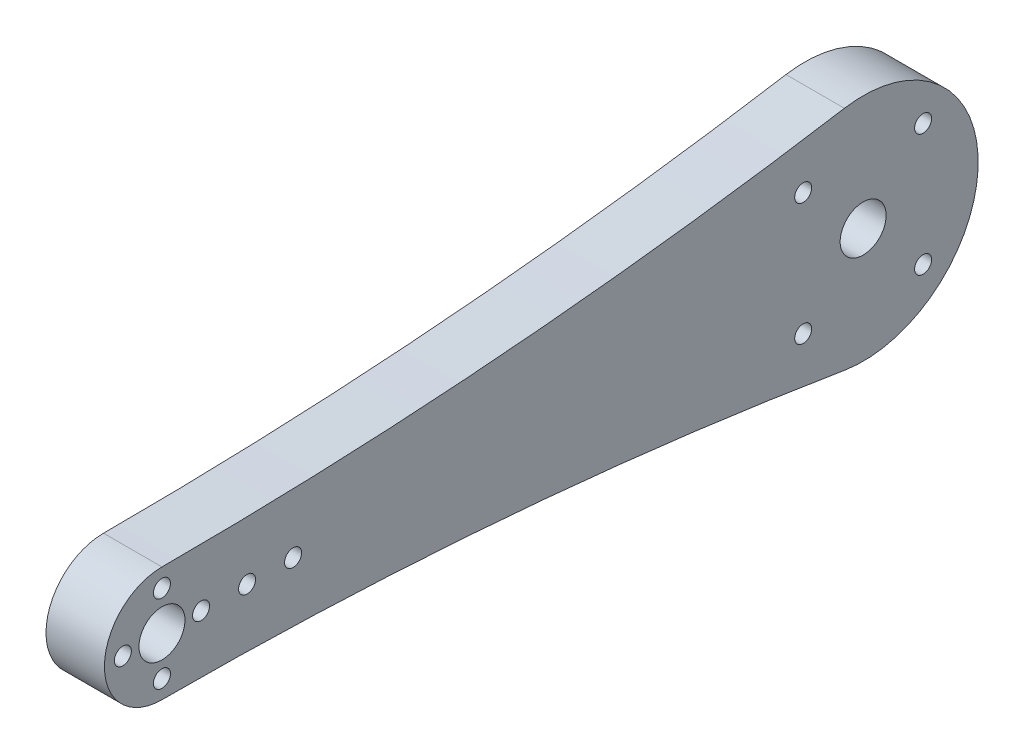
ISO-10303-21;
HEADER;
FILE_DESCRIPTION(('STEP AP214'),'2;1');
FILE_NAME('part.step','',(''),(''),'','','');
FILE_SCHEMA(('AUTOMOTIVE_DESIGN { 1 0 10303 214 1 1 1 1 }'));
ENDSEC;
DATA;
#1=APPLICATION_CONTEXT('core data for automotive mechanical design processes');
#2=APPLICATION_PROTOCOL_DEFINITION('international standard','automotive_design',2000,#1);
#3=PRODUCT_CONTEXT('',#1,'mechanical');
#4=PRODUCT('Part','Part','',(#3));
#5=PRODUCT_RELATED_PRODUCT_CATEGORY('part','',(#4));
#6=PRODUCT_DEFINITION_FORMATION('','',#4);
#7=PRODUCT_DEFINITION_CONTEXT('part definition',#1,'design');
#8=PRODUCT_DEFINITION('design','',#6,#7);
#9=PRODUCT_DEFINITION_SHAPE('','',#8);
#10=(LENGTH_UNIT() NAMED_UNIT(*) SI_UNIT(.MILLI.,.METRE.));
#11=(NAMED_UNIT(*) PLANE_ANGLE_UNIT() SI_UNIT($,.RADIAN.));
#12=(NAMED_UNIT(*) SI_UNIT($,.STERADIAN.) SOLID_ANGLE_UNIT());
#13=UNCERTAINTY_MEASURE_WITH_UNIT(LENGTH_MEASURE(1.E-05),#10,'distance_accuracy_value','');
#14=(GEOMETRIC_REPRESENTATION_CONTEXT(3) GLOBAL_UNCERTAINTY_ASSIGNED_CONTEXT((#13)) GLOBAL_UNIT_ASSIGNED_CONTEXT((#10,
#11,#12)) REPRESENTATION_CONTEXT('',''));
#15=CARTESIAN_POINT('',(0.,0.,0.));
#16=DIRECTION('',(0.,0.,1.));
#17=DIRECTION('',(1.,0.,0.));
#18=AXIS2_PLACEMENT_3D('',#15,#16,#17);
#19=CARTESIAN_POINT('',(12.7,-922.7804,152.4));
#20=DIRECTION('',(-1.,0.,0.));
#21=DIRECTION('',(0.,0.,1.));
#22=AXIS2_PLACEMENT_3D('',#19,#20,#21);
#23=CYLINDRICAL_SURFACE('',#22,910.2804);
#24=CARTESIAN_POINT('',(0.,-922.7804,152.4));
#25=DIRECTION('',(-1.,0.,0.));
#26=DIRECTION('',(0.,0.,1.));
#27=AXIS2_PLACEMENT_3D('',#24,#25,#26);
#28=CIRCLE('',#27,910.2804);
#29=CARTESIAN_POINT('',(0.,-12.5,152.4));
#30=VERTEX_POINT('',#29);
#31=CARTESIAN_POINT('',(0.,-24.6658756026532,4.07364465244857));
#32=VERTEX_POINT('',#31);
#33=EDGE_CURVE('E96',#30,#32,#28,.T.);
#34=ORIENTED_EDGE('',*,*,#33,.T.);
#35=DIRECTION('',(-1.,0.,0.));
#36=VECTOR('',#35,1.);
#37=CARTESIAN_POINT('',(12.7,-24.6658756026532,4.07364465244857));
#38=LINE('',#37,#36);
#39=CARTESIAN_POINT('',(12.7,-24.6658756026532,4.07364465244857));
#40=VERTEX_POINT('',#39);
#41=EDGE_CURVE('E11',#40,#32,#38,.T.);
#42=ORIENTED_EDGE('',*,*,#41,.F.);
#43=CARTESIAN_POINT('',(12.7,-922.7804,152.4));
#44=DIRECTION('',(-1.,0.,0.));
#45=DIRECTION('',(0.,0.,1.));
#46=AXIS2_PLACEMENT_3D('',#43,#44,#45);
#47=CIRCLE('',#46,910.2804);
#48=CARTESIAN_POINT('',(12.7,-12.5,152.4));
#49=VERTEX_POINT('',#48);
#50=EDGE_CURVE('E84',#49,#40,#47,.T.);
#51=ORIENTED_EDGE('',*,*,#50,.F.);
#52=DIRECTION('',(-1.,0.,0.));
#53=VECTOR('',#52,1.);
#54=CARTESIAN_POINT('',(12.7,-12.5,152.4));
#55=LINE('',#54,#53);
#56=EDGE_CURVE('E92',#49,#30,#55,.T.);
#57=ORIENTED_EDGE('',*,*,#56,.T.);
#58=EDGE_LOOP('',(#34,#42,#51,#57));
#59=FACE_BOUND('',#58,.T.);
#60=ADVANCED_FACE('F33',(#59),#23,.F.);
#61=CARTESIAN_POINT('',(12.7,0.,0.));
#62=DIRECTION('',(-1.,0.,0.));
#63=DIRECTION('',(0.,0.,1.));
#64=AXIS2_PLACEMENT_3D('',#61,#62,#63);
#65=CYLINDRICAL_SURFACE('',#64,24.9999999999997);
#66=CARTESIAN_POINT('',(0.,0.,0.));
#67=DIRECTION('',(1.,0.,0.));
#68=DIRECTION('',(0.,0.,-1.));
#69=AXIS2_PLACEMENT_3D('',#66,#67,#68);
#70=CIRCLE('',#69,24.9999999999997);
#71=CARTESIAN_POINT('',(0.,24.6658756026533,4.0736446524488));
#72=VERTEX_POINT('',#71);
#73=EDGE_CURVE('E88',#32,#72,#70,.T.);
#74=ORIENTED_EDGE('',*,*,#73,.T.);
#75=DIRECTION('',(-1.,0.,0.));
#76=VECTOR('',#75,1.);
#77=CARTESIAN_POINT('',(12.7,24.6658756026533,4.0736446524488));
#78=LINE('',#77,#76);
#79=CARTESIAN_POINT('',(12.7,24.6658756026533,4.0736446524488));
#80=VERTEX_POINT('',#79);
#81=EDGE_CURVE('E41',#80,#72,#78,.T.);
#82=ORIENTED_EDGE('',*,*,#81,.F.);
#83=CARTESIAN_POINT('',(12.7,0.,0.));
#84=DIRECTION('',(1.,0.,0.));
#85=DIRECTION('',(0.,0.,-1.));
#86=AXIS2_PLACEMENT_3D('',#83,#84,#85);
#87=CIRCLE('',#86,24.9999999999997);
#88=EDGE_CURVE('E79',#40,#80,#87,.T.);
#89=ORIENTED_EDGE('',*,*,#88,.F.);
#90=ORIENTED_EDGE('',*,*,#41,.T.);
#91=EDGE_LOOP('',(#74,#82,#89,#90));
#92=FACE_BOUND('',#91,.T.);
#93=ADVANCED_FACE('F87',(#92),#65,.T.);
#94=CARTESIAN_POINT('',(12.7,922.7804,152.4));
#95=DIRECTION('',(-1.,0.,0.));
#96=DIRECTION('',(0.,0.,1.));
#97=AXIS2_PLACEMENT_3D('',#94,#95,#96);
#98=CYLINDRICAL_SURFACE('',#97,910.2804);
#99=CARTESIAN_POINT('',(0.,922.7804,152.4));
#100=DIRECTION('',(-1.,0.,0.));
#101=DIRECTION('',(0.,0.,-1.));
#102=AXIS2_PLACEMENT_3D('',#99,#100,#101);
#103=CIRCLE('',#102,910.2804);
#104=CARTESIAN_POINT('',(0.,12.5,152.4));
#105=VERTEX_POINT('',#104);
#106=EDGE_CURVE('E66',#72,#105,#103,.T.);
#107=ORIENTED_EDGE('',*,*,#106,.T.);
#108=DIRECTION('',(-1.,0.,0.));
#109=VECTOR('',#108,1.);
#110=CARTESIAN_POINT('',(12.7,12.5,152.4));
#111=LINE('',#110,#109);
#112=CARTESIAN_POINT('',(12.7,12.5,152.4));
#113=VERTEX_POINT('',#112);
#114=EDGE_CURVE('E89',#113,#105,#111,.T.);
#115=ORIENTED_EDGE('',*,*,#114,.F.);
#116=CARTESIAN_POINT('',(12.7,922.7804,152.4));
#117=DIRECTION('',(-1.,0.,0.));
#118=DIRECTION('',(0.,0.,-1.));
#119=AXIS2_PLACEMENT_3D('',#116,#117,#118);
#120=CIRCLE('',#119,910.2804);
#121=EDGE_CURVE('E82',#80,#113,#120,.T.);
#122=ORIENTED_EDGE('',*,*,#121,.F.);
#123=ORIENTED_EDGE('',*,*,#81,.T.);
#124=EDGE_LOOP('',(#107,#115,#122,#123));
#125=FACE_BOUND('',#124,.T.);
#126=ADVANCED_FACE('F90',(#125),#98,.F.);
#127=CARTESIAN_POINT('',(12.7,0.,152.4));
#128=DIRECTION('',(-1.,0.,0.));
#129=DIRECTION('',(0.,0.,1.));
#130=AXIS2_PLACEMENT_3D('',#127,#128,#129);
#131=CYLINDRICAL_SURFACE('',#130,12.5);
#132=CARTESIAN_POINT('',(0.,0.,152.4));
#133=DIRECTION('',(1.,0.,0.));
#134=DIRECTION('',(0.,0.,-1.));
#135=AXIS2_PLACEMENT_3D('',#132,#133,#134);
#136=CIRCLE('',#135,12.5);
#137=EDGE_CURVE('E72',#105,#30,#136,.T.);
#138=ORIENTED_EDGE('',*,*,#137,.T.);
#139=ORIENTED_EDGE('',*,*,#56,.F.);
#140=CARTESIAN_POINT('',(12.7,0.,152.4));
#141=DIRECTION('',(1.,0.,0.));
#142=DIRECTION('',(0.,0.,-1.));
#143=AXIS2_PLACEMENT_3D('',#140,#141,#142);
#144=CIRCLE('',#143,12.5);
#145=EDGE_CURVE('E49',#113,#49,#144,.T.);
#146=ORIENTED_EDGE('',*,*,#145,.F.);
#147=ORIENTED_EDGE('',*,*,#114,.T.);
#148=EDGE_LOOP('',(#138,#139,#146,#147));
#149=FACE_BOUND('',#148,.T.);
#150=ADVANCED_FACE('F104',(#149),#131,.T.);
#151=CARTESIAN_POINT('',(12.7,-461.3902,76.2));
#152=DIRECTION('',(-1.,0.,0.));
#153=DIRECTION('',(0.,0.,1.));
#154=AXIS2_PLACEMENT_3D('',#151,#152,#153);
#155=PLANE('',#154);
#156=CARTESIAN_POINT('',(12.7,1.035652129618E-13,123.9));
#157=DIRECTION('',(1.,0.,0.));
#158=DIRECTION('',(0.,0.,-1.));
#159=AXIS2_PLACEMENT_3D('',#156,#157,#158);
#160=CIRCLE('',#159,1.85);
#161=CARTESIAN_POINT('',(12.7,1.035652129618E-13,122.05));
#162=VERTEX_POINT('',#161);
#163=EDGE_CURVE('E176',#162,#162,#160,.T.);
#164=ORIENTED_EDGE('',*,*,#163,.F.);
#165=EDGE_LOOP('',(#164));
#166=FACE_BOUND('',#165,.T.);
#167=CARTESIAN_POINT('',(12.7,1.57329099321661E-13,133.9));
#168=DIRECTION('',(1.,0.,0.));
#169=DIRECTION('',(0.,0.,-1.));
#170=AXIS2_PLACEMENT_3D('',#167,#168,#169);
#171=CIRCLE('',#170,1.85);
#172=CARTESIAN_POINT('',(12.7,1.57329099321661E-13,132.05));
#173=VERTEX_POINT('',#172);
#174=EDGE_CURVE('E170',#173,#173,#171,.T.);
#175=ORIENTED_EDGE('',*,*,#174,.F.);
#176=EDGE_LOOP('',(#175));
#177=FACE_BOUND('',#176,.T.);
#178=CARTESIAN_POINT('',(12.7,8.50000000000001,152.4));
#179=DIRECTION('',(1.,0.,0.));
#180=DIRECTION('',(0.,0.,-1.));
#181=AXIS2_PLACEMENT_3D('',#178,#179,#180);
#182=CIRCLE('',#181,1.85);
#183=CARTESIAN_POINT('',(12.7,8.50000000000001,150.55));
#184=VERTEX_POINT('',#183);
#185=EDGE_CURVE('E164',#184,#184,#182,.T.);
#186=ORIENTED_EDGE('',*,*,#185,.F.);
#187=EDGE_LOOP('',(#186));
#188=FACE_BOUND('',#187,.T.);
#189=CARTESIAN_POINT('',(12.7,0.,160.9));
#190=DIRECTION('',(1.,0.,0.));
#191=DIRECTION('',(0.,0.,-1.));
#192=AXIS2_PLACEMENT_3D('',#189,#190,#191);
#193=CIRCLE('',#192,1.85);
#194=CARTESIAN_POINT('',(12.7,0.,159.05));
#195=VERTEX_POINT('',#194);
#196=EDGE_CURVE('E158',#195,#195,#193,.T.);
#197=ORIENTED_EDGE('',*,*,#196,.F.);
#198=EDGE_LOOP('',(#197));
#199=FACE_BOUND('',#198,.T.);
#200=CARTESIAN_POINT('',(12.7,-8.5,152.4));
#201=DIRECTION('',(1.,0.,0.));
#202=DIRECTION('',(0.,0.,-1.));
#203=AXIS2_PLACEMENT_3D('',#200,#201,#202);
#204=CIRCLE('',#203,1.85);
#205=CARTESIAN_POINT('',(12.7,-8.5,150.55));
#206=VERTEX_POINT('',#205);
#207=EDGE_CURVE('E152',#206,#206,#204,.T.);
#208=ORIENTED_EDGE('',*,*,#207,.F.);
#209=EDGE_LOOP('',(#208));
#210=FACE_BOUND('',#209,.T.);
#211=CARTESIAN_POINT('',(12.7,0.,143.9));
#212=DIRECTION('',(1.,0.,0.));
#213=DIRECTION('',(0.,0.,-1.));
#214=AXIS2_PLACEMENT_3D('',#211,#212,#213);
#215=CIRCLE('',#214,1.85);
#216=CARTESIAN_POINT('',(12.7,0.,142.05));
#217=VERTEX_POINT('',#216);
#218=EDGE_CURVE('E146',#217,#217,#215,.T.);
#219=ORIENTED_EDGE('',*,*,#218,.F.);
#220=EDGE_LOOP('',(#219));
#221=FACE_BOUND('',#220,.T.);
#222=CARTESIAN_POINT('',(12.7,0.,152.4));
#223=DIRECTION('',(1.,0.,0.));
#224=DIRECTION('',(0.,0.,-1.));
#225=AXIS2_PLACEMENT_3D('',#222,#223,#224);
#226=CIRCLE('',#225,5.00000000000002);
#227=CARTESIAN_POINT('',(12.7,0.,147.4));
#228=VERTEX_POINT('',#227);
#229=EDGE_CURVE('E140',#228,#228,#226,.T.);
#230=ORIENTED_EDGE('',*,*,#229,.F.);
#231=EDGE_LOOP('',(#230));
#232=FACE_BOUND('',#231,.T.);
#233=CARTESIAN_POINT('',(12.7,13.2747984248508,13.0294986716924));
#234=DIRECTION('',(-1.,0.,0.));
#235=DIRECTION('',(0.,0.,1.));
#236=AXIS2_PLACEMENT_3D('',#233,#234,#235);
#237=CIRCLE('',#236,1.85);
#238=CARTESIAN_POINT('',(12.7,13.2747984248508,14.8794986716924));
#239=VERTEX_POINT('',#238);
#240=EDGE_CURVE('E131',#239,#239,#237,.T.);
#241=ORIENTED_EDGE('',*,*,#240,.T.);
#242=EDGE_LOOP('',(#241));
#243=FACE_BOUND('',#242,.T.);
#244=CARTESIAN_POINT('',(12.7,-13.2747984248508,13.0294986716924));
#245=DIRECTION('',(1.,0.,0.));
#246=DIRECTION('',(0.,0.,-1.));
#247=AXIS2_PLACEMENT_3D('',#244,#245,#246);
#248=CIRCLE('',#247,1.85);
#249=CARTESIAN_POINT('',(12.7,-13.2747984248508,11.1794986716924));
#250=VERTEX_POINT('',#249);
#251=EDGE_CURVE('E125',#250,#250,#248,.T.);
#252=ORIENTED_EDGE('',*,*,#251,.F.);
#253=EDGE_LOOP('',(#252));
#254=FACE_BOUND('',#253,.T.);
#255=CARTESIAN_POINT('',(12.7,-13.2747984248508,-13.0294986716924));
#256=DIRECTION('',(1.,0.,0.));
#257=DIRECTION('',(0.,0.,-1.));
#258=AXIS2_PLACEMENT_3D('',#255,#256,#257);
#259=CIRCLE('',#258,1.85);
#260=CARTESIAN_POINT('',(12.7,-13.2747984248508,-14.8794986716924));
#261=VERTEX_POINT('',#260);
#262=EDGE_CURVE('E119',#261,#261,#259,.F.);
#263=ORIENTED_EDGE('',*,*,#262,.T.);
#264=EDGE_LOOP('',(#263));
#265=FACE_BOUND('',#264,.T.);
#266=CARTESIAN_POINT('',(12.7,13.2747984248508,-13.0294986716924));
#267=DIRECTION('',(1.,0.,0.));
#268=DIRECTION('',(0.,0.,-1.));
#269=AXIS2_PLACEMENT_3D('',#266,#267,#268);
#270=CIRCLE('',#269,1.85);
#271=CARTESIAN_POINT('',(12.7,13.2747984248508,-14.8794986716924));
#272=VERTEX_POINT('',#271);
#273=EDGE_CURVE('E113',#272,#272,#270,.T.);
#274=ORIENTED_EDGE('',*,*,#273,.F.);
#275=EDGE_LOOP('',(#274));
#276=FACE_BOUND('',#275,.T.);
#277=CARTESIAN_POINT('',(12.7,0.,0.));
#278=DIRECTION('',(1.,0.,0.));
#279=DIRECTION('',(0.,0.,-1.));
#280=AXIS2_PLACEMENT_3D('',#277,#278,#279);
#281=CIRCLE('',#280,5.);
#282=CARTESIAN_POINT('',(12.7,0.,-5.));
#283=VERTEX_POINT('',#282);
#284=EDGE_CURVE('E110',#283,#283,#281,.T.);
#285=ORIENTED_EDGE('',*,*,#284,.F.);
#286=EDGE_LOOP('',(#285));
#287=FACE_BOUND('',#286,.T.);
#288=ORIENTED_EDGE('',*,*,#50,.T.);
#289=ORIENTED_EDGE('',*,*,#88,.T.);
#290=ORIENTED_EDGE('',*,*,#121,.T.);
#291=ORIENTED_EDGE('',*,*,#145,.T.);
#292=EDGE_LOOP('',(#288,#289,#290,#291));
#293=FACE_BOUND('',#292,.T.);
#294=ADVANCED_FACE('F80',(#166,#177,#188,#199,#210,#221,#232,#243,#254,#265,#276,#287,#293),
#155,.F.);
#295=CARTESIAN_POINT('',(0.,-461.3902,76.2));
#296=DIRECTION('',(-1.,0.,0.));
#297=DIRECTION('',(0.,0.,1.));
#298=AXIS2_PLACEMENT_3D('',#295,#296,#297);
#299=PLANE('',#298);
#300=CARTESIAN_POINT('',(0.,1.035652129618E-13,123.9));
#301=DIRECTION('',(1.,0.,0.));
#302=DIRECTION('',(0.,0.,-1.));
#303=AXIS2_PLACEMENT_3D('',#300,#301,#302);
#304=CIRCLE('',#303,1.85);
#305=CARTESIAN_POINT('',(0.,1.035652129618E-13,122.05));
#306=VERTEX_POINT('',#305);
#307=EDGE_CURVE('E173',#306,#306,#304,.T.);
#308=ORIENTED_EDGE('',*,*,#307,.T.);
#309=EDGE_LOOP('',(#308));
#310=FACE_BOUND('',#309,.T.);
#311=CARTESIAN_POINT('',(0.,1.57329099321661E-13,133.9));
#312=DIRECTION('',(1.,0.,0.));
#313=DIRECTION('',(0.,0.,-1.));
#314=AXIS2_PLACEMENT_3D('',#311,#312,#313);
#315=CIRCLE('',#314,1.85);
#316=CARTESIAN_POINT('',(0.,1.57329099321661E-13,132.05));
#317=VERTEX_POINT('',#316);
#318=EDGE_CURVE('E167',#317,#317,#315,.T.);
#319=ORIENTED_EDGE('',*,*,#318,.T.);
#320=EDGE_LOOP('',(#319));
#321=FACE_BOUND('',#320,.T.);
#322=CARTESIAN_POINT('',(0.,8.50000000000001,152.4));
#323=DIRECTION('',(1.,0.,0.));
#324=DIRECTION('',(0.,0.,-1.));
#325=AXIS2_PLACEMENT_3D('',#322,#323,#324);
#326=CIRCLE('',#325,1.85);
#327=CARTESIAN_POINT('',(0.,8.50000000000001,150.55));
#328=VERTEX_POINT('',#327);
#329=EDGE_CURVE('E161',#328,#328,#326,.T.);
#330=ORIENTED_EDGE('',*,*,#329,.T.);
#331=EDGE_LOOP('',(#330));
#332=FACE_BOUND('',#331,.T.);
#333=CARTESIAN_POINT('',(0.,0.,160.9));
#334=DIRECTION('',(1.,0.,0.));
#335=DIRECTION('',(0.,0.,-1.));
#336=AXIS2_PLACEMENT_3D('',#333,#334,#335);
#337=CIRCLE('',#336,1.85);
#338=CARTESIAN_POINT('',(0.,0.,159.05));
#339=VERTEX_POINT('',#338);
#340=EDGE_CURVE('E155',#339,#339,#337,.T.);
#341=ORIENTED_EDGE('',*,*,#340,.T.);
#342=EDGE_LOOP('',(#341));
#343=FACE_BOUND('',#342,.T.);
#344=CARTESIAN_POINT('',(0.,-8.5,152.4));
#345=DIRECTION('',(1.,0.,0.));
#346=DIRECTION('',(0.,0.,-1.));
#347=AXIS2_PLACEMENT_3D('',#344,#345,#346);
#348=CIRCLE('',#347,1.85);
#349=CARTESIAN_POINT('',(0.,-8.5,150.55));
#350=VERTEX_POINT('',#349);
#351=EDGE_CURVE('E149',#350,#350,#348,.T.);
#352=ORIENTED_EDGE('',*,*,#351,.T.);
#353=EDGE_LOOP('',(#352));
#354=FACE_BOUND('',#353,.T.);
#355=CARTESIAN_POINT('',(0.,0.,143.9));
#356=DIRECTION('',(1.,0.,0.));
#357=DIRECTION('',(0.,0.,-1.));
#358=AXIS2_PLACEMENT_3D('',#355,#356,#357);
#359=CIRCLE('',#358,1.85);
#360=CARTESIAN_POINT('',(0.,0.,142.05));
#361=VERTEX_POINT('',#360);
#362=EDGE_CURVE('E143',#361,#361,#359,.T.);
#363=ORIENTED_EDGE('',*,*,#362,.T.);
#364=EDGE_LOOP('',(#363));
#365=FACE_BOUND('',#364,.T.);
#366=CARTESIAN_POINT('',(0.,0.,152.4));
#367=DIRECTION('',(1.,0.,0.));
#368=DIRECTION('',(0.,0.,-1.));
#369=AXIS2_PLACEMENT_3D('',#366,#367,#368);
#370=CIRCLE('',#369,5.00000000000002);
#371=CARTESIAN_POINT('',(0.,0.,147.4));
#372=VERTEX_POINT('',#371);
#373=EDGE_CURVE('E137',#372,#372,#370,.T.);
#374=ORIENTED_EDGE('',*,*,#373,.T.);
#375=EDGE_LOOP('',(#374));
#376=FACE_BOUND('',#375,.T.);
#377=CARTESIAN_POINT('',(0.,13.2747984248508,13.0294986716924));
#378=DIRECTION('',(-1.,0.,0.));
#379=DIRECTION('',(0.,0.,1.));
#380=AXIS2_PLACEMENT_3D('',#377,#378,#379);
#381=CIRCLE('',#380,1.85);
#382=CARTESIAN_POINT('',(0.,13.2747984248508,14.8794986716924));
#383=VERTEX_POINT('',#382);
#384=EDGE_CURVE('E134',#383,#383,#381,.T.);
#385=ORIENTED_EDGE('',*,*,#384,.F.);
#386=EDGE_LOOP('',(#385));
#387=FACE_BOUND('',#386,.T.);
#388=CARTESIAN_POINT('',(0.,-13.2747984248508,13.0294986716924));
#389=DIRECTION('',(1.,0.,0.));
#390=DIRECTION('',(0.,0.,-1.));
#391=AXIS2_PLACEMENT_3D('',#388,#389,#390);
#392=CIRCLE('',#391,1.85);
#393=CARTESIAN_POINT('',(0.,-13.2747984248508,11.1794986716924));
#394=VERTEX_POINT('',#393);
#395=EDGE_CURVE('E128',#394,#394,#392,.T.);
#396=ORIENTED_EDGE('',*,*,#395,.T.);
#397=EDGE_LOOP('',(#396));
#398=FACE_BOUND('',#397,.T.);
#399=CARTESIAN_POINT('',(0.,-13.2747984248508,-13.0294986716924));
#400=DIRECTION('',(1.,0.,0.));
#401=DIRECTION('',(0.,0.,-1.));
#402=AXIS2_PLACEMENT_3D('',#399,#400,#401);
#403=CIRCLE('',#402,1.85);
#404=CARTESIAN_POINT('',(0.,-13.2747984248508,-14.8794986716924));
#405=VERTEX_POINT('',#404);
#406=EDGE_CURVE('E122',#405,#405,#403,.F.);
#407=ORIENTED_EDGE('',*,*,#406,.F.);
#408=EDGE_LOOP('',(#407));
#409=FACE_BOUND('',#408,.T.);
#410=CARTESIAN_POINT('',(0.,13.2747984248508,-13.0294986716924));
#411=DIRECTION('',(1.,0.,0.));
#412=DIRECTION('',(0.,0.,-1.));
#413=AXIS2_PLACEMENT_3D('',#410,#411,#412);
#414=CIRCLE('',#413,1.85);
#415=CARTESIAN_POINT('',(0.,13.2747984248508,-14.8794986716924));
#416=VERTEX_POINT('',#415);
#417=EDGE_CURVE('E116',#416,#416,#414,.T.);
#418=ORIENTED_EDGE('',*,*,#417,.T.);
#419=EDGE_LOOP('',(#418));
#420=FACE_BOUND('',#419,.T.);
#421=CARTESIAN_POINT('',(0.,0.,0.));
#422=DIRECTION('',(1.,0.,0.));
#423=DIRECTION('',(0.,0.,-1.));
#424=AXIS2_PLACEMENT_3D('',#421,#422,#423);
#425=CIRCLE('',#424,5.);
#426=CARTESIAN_POINT('',(0.,0.,-5.));
#427=VERTEX_POINT('',#426);
#428=EDGE_CURVE('E99',#427,#427,#425,.T.);
#429=ORIENTED_EDGE('',*,*,#428,.T.);
#430=EDGE_LOOP('',(#429));
#431=FACE_BOUND('',#430,.T.);
#432=ORIENTED_EDGE('',*,*,#33,.F.);
#433=ORIENTED_EDGE('',*,*,#137,.F.);
#434=ORIENTED_EDGE('',*,*,#106,.F.);
#435=ORIENTED_EDGE('',*,*,#73,.F.);
#436=EDGE_LOOP('',(#432,#433,#434,#435));
#437=FACE_BOUND('',#436,.T.);
#438=ADVANCED_FACE('F107',(#310,#321,#332,#343,#354,#365,#376,#387,#398,#409,#420,#431,#437),
#299,.T.);
#439=CARTESIAN_POINT('',(0.,0.,0.));
#440=DIRECTION('',(1.,0.,0.));
#441=DIRECTION('',(0.,0.,-1.));
#442=AXIS2_PLACEMENT_3D('',#439,#440,#441);
#443=CYLINDRICAL_SURFACE('',#442,5.);
#444=ORIENTED_EDGE('',*,*,#428,.F.);
#445=EDGE_LOOP('',(#444));
#446=FACE_BOUND('',#445,.T.);
#447=ORIENTED_EDGE('',*,*,#284,.T.);
#448=EDGE_LOOP('',(#447));
#449=FACE_BOUND('',#448,.T.);
#450=ADVANCED_FACE('F216',(#446,#449),#443,.F.);
#451=CARTESIAN_POINT('',(0.,13.2747984248508,-13.0294986716924));
#452=DIRECTION('',(1.,0.,0.));
#453=DIRECTION('',(0.,0.,-1.));
#454=AXIS2_PLACEMENT_3D('',#451,#452,#453);
#455=CYLINDRICAL_SURFACE('',#454,1.85);
#456=ORIENTED_EDGE('',*,*,#417,.F.);
#457=EDGE_LOOP('',(#456));
#458=FACE_BOUND('',#457,.T.);
#459=ORIENTED_EDGE('',*,*,#273,.T.);
#460=EDGE_LOOP('',(#459));
#461=FACE_BOUND('',#460,.T.);
#462=ADVANCED_FACE('F218',(#458,#461),#455,.F.);
#463=CARTESIAN_POINT('',(0.,-13.2747984248508,-13.0294986716924));
#464=DIRECTION('',(1.,0.,0.));
#465=DIRECTION('',(0.,0.,-1.));
#466=AXIS2_PLACEMENT_3D('',#463,#464,#465);
#467=CYLINDRICAL_SURFACE('',#466,1.85);
#468=ORIENTED_EDGE('',*,*,#406,.T.);
#469=EDGE_LOOP('',(#468));
#470=FACE_BOUND('',#469,.T.);
#471=ORIENTED_EDGE('',*,*,#262,.F.);
#472=EDGE_LOOP('',(#471));
#473=FACE_BOUND('',#472,.T.);
#474=ADVANCED_FACE('F225',(#470,#473),#467,.F.);
#475=CARTESIAN_POINT('',(0.,-13.2747984248508,13.0294986716924));
#476=DIRECTION('',(1.,0.,0.));
#477=DIRECTION('',(0.,0.,-1.));
#478=AXIS2_PLACEMENT_3D('',#475,#476,#477);
#479=CYLINDRICAL_SURFACE('',#478,1.85);
#480=ORIENTED_EDGE('',*,*,#395,.F.);
#481=EDGE_LOOP('',(#480));
#482=FACE_BOUND('',#481,.T.);
#483=ORIENTED_EDGE('',*,*,#251,.T.);
#484=EDGE_LOOP('',(#483));
#485=FACE_BOUND('',#484,.T.);
#486=ADVANCED_FACE('F332',(#482,#485),#479,.F.);
#487=CARTESIAN_POINT('',(0.,13.2747984248508,13.0294986716924));
#488=DIRECTION('',(1.,0.,0.));
#489=DIRECTION('',(0.,0.,-1.));
#490=AXIS2_PLACEMENT_3D('',#487,#488,#489);
#491=CYLINDRICAL_SURFACE('',#490,1.85);
#492=ORIENTED_EDGE('',*,*,#384,.T.);
#493=EDGE_LOOP('',(#492));
#494=FACE_BOUND('',#493,.T.);
#495=ORIENTED_EDGE('',*,*,#240,.F.);
#496=EDGE_LOOP('',(#495));
#497=FACE_BOUND('',#496,.T.);
#498=ADVANCED_FACE('F267',(#494,#497),#491,.F.);
#499=CARTESIAN_POINT('',(0.,0.,152.4));
#500=DIRECTION('',(1.,0.,0.));
#501=DIRECTION('',(0.,0.,-1.));
#502=AXIS2_PLACEMENT_3D('',#499,#500,#501);
#503=CYLINDRICAL_SURFACE('',#502,5.00000000000002);
#504=ORIENTED_EDGE('',*,*,#373,.F.);
#505=EDGE_LOOP('',(#504));
#506=FACE_BOUND('',#505,.T.);
#507=ORIENTED_EDGE('',*,*,#229,.T.);
#508=EDGE_LOOP('',(#507));
#509=FACE_BOUND('',#508,.T.);
#510=ADVANCED_FACE('F261',(#506,#509),#503,.F.);
#511=CARTESIAN_POINT('',(0.,0.,143.9));
#512=DIRECTION('',(1.,0.,0.));
#513=DIRECTION('',(0.,0.,-1.));
#514=AXIS2_PLACEMENT_3D('',#511,#512,#513);
#515=CYLINDRICAL_SURFACE('',#514,1.85);
#516=ORIENTED_EDGE('',*,*,#362,.F.);
#517=EDGE_LOOP('',(#516));
#518=FACE_BOUND('',#517,.T.);
#519=ORIENTED_EDGE('',*,*,#218,.T.);
#520=EDGE_LOOP('',(#519));
#521=FACE_BOUND('',#520,.T.);
#522=ADVANCED_FACE('F266',(#518,#521),#515,.F.);
#523=CARTESIAN_POINT('',(0.,-8.5,152.4));
#524=DIRECTION('',(1.,0.,0.));
#525=DIRECTION('',(0.,0.,-1.));
#526=AXIS2_PLACEMENT_3D('',#523,#524,#525);
#527=CYLINDRICAL_SURFACE('',#526,1.85);
#528=ORIENTED_EDGE('',*,*,#351,.F.);
#529=EDGE_LOOP('',(#528));
#530=FACE_BOUND('',#529,.T.);
#531=ORIENTED_EDGE('',*,*,#207,.T.);
#532=EDGE_LOOP('',(#531));
#533=FACE_BOUND('',#532,.T.);
#534=ADVANCED_FACE('F279',(#530,#533),#527,.F.);
#535=CARTESIAN_POINT('',(0.,0.,160.9));
#536=DIRECTION('',(1.,0.,0.));
#537=DIRECTION('',(0.,0.,-1.));
#538=AXIS2_PLACEMENT_3D('',#535,#536,#537);
#539=CYLINDRICAL_SURFACE('',#538,1.85);
#540=ORIENTED_EDGE('',*,*,#340,.F.);
#541=EDGE_LOOP('',(#540));
#542=FACE_BOUND('',#541,.T.);
#543=ORIENTED_EDGE('',*,*,#196,.T.);
#544=EDGE_LOOP('',(#543));
#545=FACE_BOUND('',#544,.T.);
#546=ADVANCED_FACE('F289',(#542,#545),#539,.F.);
#547=CARTESIAN_POINT('',(0.,8.50000000000001,152.4));
#548=DIRECTION('',(1.,0.,0.));
#549=DIRECTION('',(0.,0.,-1.));
#550=AXIS2_PLACEMENT_3D('',#547,#548,#549);
#551=CYLINDRICAL_SURFACE('',#550,1.85);
#552=ORIENTED_EDGE('',*,*,#329,.F.);
#553=EDGE_LOOP('',(#552));
#554=FACE_BOUND('',#553,.T.);
#555=ORIENTED_EDGE('',*,*,#185,.T.);
#556=EDGE_LOOP('',(#555));
#557=FACE_BOUND('',#556,.T.);
#558=ADVANCED_FACE('F299',(#554,#557),#551,.F.);
#559=CARTESIAN_POINT('',(0.,1.57329099321661E-13,133.9));
#560=DIRECTION('',(1.,0.,0.));
#561=DIRECTION('',(0.,0.,-1.));
#562=AXIS2_PLACEMENT_3D('',#559,#560,#561);
#563=CYLINDRICAL_SURFACE('',#562,1.85);
#564=ORIENTED_EDGE('',*,*,#318,.F.);
#565=EDGE_LOOP('',(#564));
#566=FACE_BOUND('',#565,.T.);
#567=ORIENTED_EDGE('',*,*,#174,.T.);
#568=EDGE_LOOP('',(#567));
#569=FACE_BOUND('',#568,.T.);
#570=ADVANCED_FACE('F187',(#566,#569),#563,.F.);
#571=CARTESIAN_POINT('',(0.,1.035652129618E-13,123.9));
#572=DIRECTION('',(1.,0.,0.));
#573=DIRECTION('',(0.,0.,-1.));
#574=AXIS2_PLACEMENT_3D('',#571,#572,#573);
#575=CYLINDRICAL_SURFACE('',#574,1.85);
#576=ORIENTED_EDGE('',*,*,#307,.F.);
#577=EDGE_LOOP('',(#576));
#578=FACE_BOUND('',#577,.T.);
#579=ORIENTED_EDGE('',*,*,#163,.T.);
#580=EDGE_LOOP('',(#579));
#581=FACE_BOUND('',#580,.T.);
#582=ADVANCED_FACE('F184',(#578,#581),#575,.F.);
#583=CLOSED_SHELL('',(#60,#93,#126,#150,#294,#438,#450,#462,#474,#486,#498,#510,#522,#534,#546,
#558,#570,#582));
#584=MANIFOLD_SOLID_BREP('B2',#583);
#585=ADVANCED_BREP_SHAPE_REPRESENTATION('',(#18,#584),#14);
#586=SHAPE_DEFINITION_REPRESENTATION(#9,#585);
ENDSEC;
END-ISO-10303-21;
